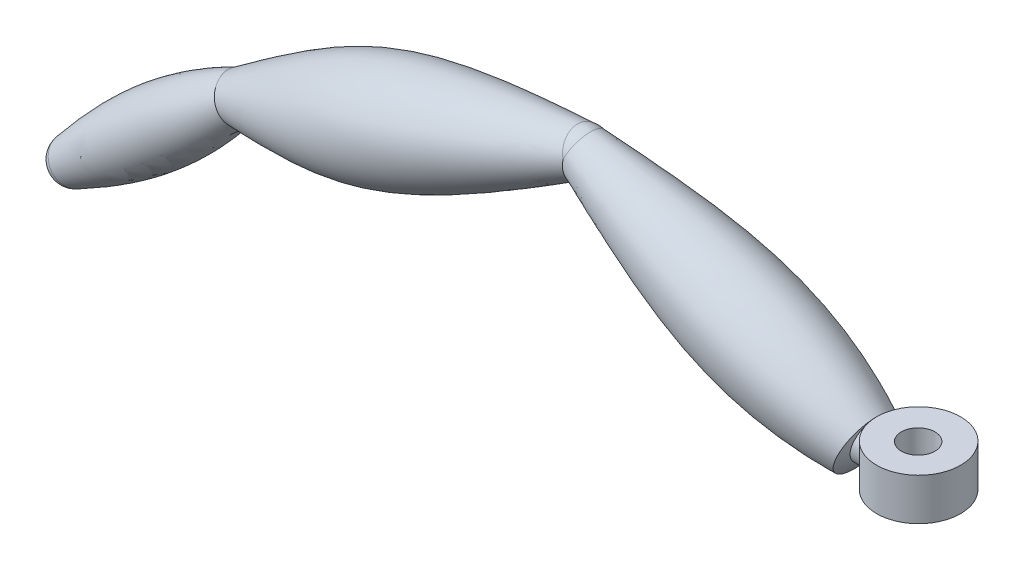
ISO-10303-21;
HEADER;
FILE_DESCRIPTION(('STEP AP214'),'2;1');
FILE_NAME('part.step','',(''),(''),'','','');
FILE_SCHEMA(('AUTOMOTIVE_DESIGN { 1 0 10303 214 1 1 1 1 }'));
ENDSEC;
DATA;
#1=APPLICATION_CONTEXT('core data for automotive mechanical design processes');
#2=APPLICATION_PROTOCOL_DEFINITION('international standard','automotive_design',2000,#1);
#3=PRODUCT_CONTEXT('',#1,'mechanical');
#4=PRODUCT('Part','Part','',(#3));
#5=PRODUCT_RELATED_PRODUCT_CATEGORY('part','',(#4));
#6=PRODUCT_DEFINITION_FORMATION('','',#4);
#7=PRODUCT_DEFINITION_CONTEXT('part definition',#1,'design');
#8=PRODUCT_DEFINITION('design','',#6,#7);
#9=PRODUCT_DEFINITION_SHAPE('','',#8);
#10=(LENGTH_UNIT() NAMED_UNIT(*) SI_UNIT(.MILLI.,.METRE.));
#11=(NAMED_UNIT(*) PLANE_ANGLE_UNIT() SI_UNIT($,.RADIAN.));
#12=(NAMED_UNIT(*) SI_UNIT($,.STERADIAN.) SOLID_ANGLE_UNIT());
#13=UNCERTAINTY_MEASURE_WITH_UNIT(LENGTH_MEASURE(1.E-05),#10,'distance_accuracy_value','');
#14=(GEOMETRIC_REPRESENTATION_CONTEXT(3) GLOBAL_UNCERTAINTY_ASSIGNED_CONTEXT((#13)) GLOBAL_UNIT_ASSIGNED_CONTEXT((#10,
#11,#12)) REPRESENTATION_CONTEXT('',''));
#15=CARTESIAN_POINT('',(0.,0.,0.));
#16=DIRECTION('',(0.,0.,1.));
#17=DIRECTION('',(1.,0.,0.));
#18=AXIS2_PLACEMENT_3D('',#15,#16,#17);
#19=CARTESIAN_POINT('',(0.,22.5,0.));
#20=DIRECTION('',(1.,0.,0.));
#21=DIRECTION('',(0.,0.,-1.));
#22=AXIS2_PLACEMENT_3D('',#19,#20,#21);
#23=CYLINDRICAL_SURFACE('',#22,2.5);
#24=CARTESIAN_POINT('',(0.,20.,0.));
#25=CARTESIAN_POINT('',(-1.17138937703847E-05,19.9999893955995,-0.0659945939242112));
#26=CARTESIAN_POINT('',(0.00130627496453097,20.0026128725809,-0.131981678166619));
#27=CARTESIAN_POINT('',(0.00651377506543621,20.0130456324057,-0.263416694327165));
#28=CARTESIAN_POINT('',(0.0104022536243341,20.0208528327151,-0.32886483207864));
#29=CARTESIAN_POINT('',(0.0206398313294794,20.0415240619075,-0.458458579220741));
#30=CARTESIAN_POINT('',(0.0269777485529216,20.0543651145348,-0.522608733342374));
#31=CARTESIAN_POINT('',(0.0419449884184015,20.0849460861392,-0.649442629369404));
#32=CARTESIAN_POINT('',(0.0505744529951445,20.1026863085656,-0.712126280180209));
#33=CARTESIAN_POINT('',(0.0795769838774978,20.162945602456,-0.897194242012672));
#34=CARTESIAN_POINT('',(0.103086993268934,20.21254753448,-1.016867788626));
#35=CARTESIAN_POINT('',(0.156324895886675,20.3288588839233,-1.2460823597176));
#36=CARTESIAN_POINT('',(0.186058997667385,20.395585398311,-1.35561310816491));
#37=CARTESIAN_POINT('',(0.251094865454986,20.5487959317913,-1.56876965448512));
#38=CARTESIAN_POINT('',(0.286623608441039,20.6362249500665,-1.6716472265544));
#39=CARTESIAN_POINT('',(0.358504634245855,20.8263147188106,-1.86195920773033));
#40=CARTESIAN_POINT('',(0.394857440796358,20.9289853999141,-1.94938346633227));
#41=CARTESIAN_POINT('',(0.467526632987598,21.1562096667926,-2.11313055563156));
#42=CARTESIAN_POINT('',(0.503621178310607,21.2818432189483,-2.18806500635172));
#43=CARTESIAN_POINT('',(0.567851214402098,21.5459216785351,-2.31542194436877));
#44=CARTESIAN_POINT('',(0.595992573888057,21.684357038768,-2.36786104603457));
#45=CARTESIAN_POINT('',(0.638553087717949,21.9616612270305,-2.44533064899433));
#46=CARTESIAN_POINT('',(0.653692868909429,22.1000079774338,-2.47181403507143));
#47=CARTESIAN_POINT('',(0.670452710474022,22.3799438729262,-2.50106742405651));
#48=CARTESIAN_POINT('',(0.672085825492837,22.5215297544934,-2.50386032467989));
#49=CARTESIAN_POINT('',(0.662226693981773,22.7857164024724,-2.48671813080397));
#50=CARTESIAN_POINT('',(0.652280691655278,22.908562742042,-2.46946102754643));
#51=CARTESIAN_POINT('',(0.62309386517335,23.1493073331544,-2.41734886311099));
#52=CARTESIAN_POINT('',(0.603850281200078,23.267204104207,-2.38248857660984));
#53=CARTESIAN_POINT('',(0.557813412874941,23.4980712134798,-2.29552507647041));
#54=CARTESIAN_POINT('',(0.530854734978881,23.6108628662725,-2.24303918598237));
#55=CARTESIAN_POINT('',(0.472415757920147,23.826582895938,-2.12260603218038));
#56=CARTESIAN_POINT('',(0.440933306029379,23.9295065378214,-2.05465139871124));
#57=CARTESIAN_POINT('',(0.372172197438131,24.1362997124444,-1.89516801589999));
#58=CARTESIAN_POINT('',(0.334664647901975,24.2386356932321,-1.80174299763042));
#59=CARTESIAN_POINT('',(0.261311546556032,24.4268334094933,-1.59889462812584));
#60=CARTESIAN_POINT('',(0.225466899968885,24.5126862501416,-1.48946269485361));
#61=CARTESIAN_POINT('',(0.157433046565047,24.6692540266303,-1.25123381518436));
#62=CARTESIAN_POINT('',(0.125494370462291,24.7390693379238,-1.12176903798507));
#63=CARTESIAN_POINT('',(0.0710285759100375,24.8552926743655,-0.851005141128091));
#64=CARTESIAN_POINT('',(0.0484845498506709,24.9017427814998,-0.709727835760625));
#65=CARTESIAN_POINT('',(0.0215341863926635,24.9567184372476,-0.472754017208435));
#66=CARTESIAN_POINT('',(0.0135128793517502,24.9728937009653,-0.379179611728296));
#67=CARTESIAN_POINT('',(0.00272311336887431,24.9945547029833,-0.190431151983904));
#68=CARTESIAN_POINT('',(-4.10790202478774E-05,25.0000317589628,-0.0952558616156545));
#69=CARTESIAN_POINT('',(0.,25.,0.));
#70=B_SPLINE_CURVE_WITH_KNOTS('',3,(#24,#25,#26,#27,#28,#29,#30,#31,#32,#33,#34,#35,#36,#37,#38,
#39,#40,#41,#42,#43,#44,#45,#46,#47,#48,#49,#50,#51,#52,#53,#54,#55,#56,#57,#58,#59,#60,#61,#62,
#63,#64,#65,#66,#67,#68,#69),.UNSPECIFIED.,.F.,.F.,(4,2,2,2,2,2,2,2,2,2,2,2,2,2,2,2,2,2,2,2,2,2,
4),(0.,0.197906017790933,0.39573257593062,0.592666505722353,0.789612636126722,1.18268518461313,
1.57615170893246,1.99321833479708,2.4105579009124,2.86029082016818,3.30969100632553,
3.7321878263024,4.1542762411573,4.52588913596464,4.89761240512583,5.27799306487008,
5.65855533951603,6.08735263258942,6.51638067188693,6.96554518397056,7.4138978039059,
7.6990904902145,7.98451453371651),.UNSPECIFIED.);
#71=CARTESIAN_POINT('',(0.,20.,0.));
#72=VERTEX_POINT('',#71);
#73=CARTESIAN_POINT('',(0.,25.,0.));
#74=VERTEX_POINT('',#73);
#75=EDGE_CURVE('E11',#72,#74,#70,.T.);
#76=ORIENTED_EDGE('',*,*,#75,.F.);
#77=CARTESIAN_POINT('',(0.,25.,0.));
#78=CARTESIAN_POINT('',(-1.17138937738109E-05,25.0000106044005,0.0659945939242115));
#79=CARTESIAN_POINT('',(0.001306274964528,24.9973871274191,0.131981678166619));
#80=CARTESIAN_POINT('',(0.00651377506543541,24.9869543675942,0.263416694327165));
#81=CARTESIAN_POINT('',(0.010402253624335,24.9791471672848,0.32886483207864));
#82=CARTESIAN_POINT('',(0.0206398313294801,24.9584759380925,0.45845857922074));
#83=CARTESIAN_POINT('',(0.0269777485529205,24.9456348854651,0.522608733342374));
#84=CARTESIAN_POINT('',(0.0419449884183994,24.9150539138607,0.649442629369405));
#85=CARTESIAN_POINT('',(0.0505744529951433,24.8973136914344,0.71212628018021));
#86=CARTESIAN_POINT('',(0.0795769838774977,24.8370543975439,0.897194242012672));
#87=CARTESIAN_POINT('',(0.103086993268933,24.78745246552,1.016867788626));
#88=CARTESIAN_POINT('',(0.156324895886674,24.6711411160767,1.2460823597176));
#89=CARTESIAN_POINT('',(0.186058997667384,24.604414601689,1.35561310816491));
#90=CARTESIAN_POINT('',(0.251094865454986,24.4512040682086,1.56876965448512));
#91=CARTESIAN_POINT('',(0.286623608441038,24.3637750499335,1.6716472265544));
#92=CARTESIAN_POINT('',(0.358504634245854,24.1736852811894,1.86195920773033));
#93=CARTESIAN_POINT('',(0.394857440796358,24.0710146000858,1.94938346633227));
#94=CARTESIAN_POINT('',(0.467526632987597,23.8437903332074,2.11313055563156));
#95=CARTESIAN_POINT('',(0.503621178310605,23.7181567810517,2.18806500635172));
#96=CARTESIAN_POINT('',(0.567851214402096,23.4540783214648,2.31542194436877));
#97=CARTESIAN_POINT('',(0.595992573888057,23.315642961232,2.36786104603457));
#98=CARTESIAN_POINT('',(0.638553087717949,23.0383387729694,2.44533064899433));
#99=CARTESIAN_POINT('',(0.653692868909428,22.8999920225661,2.47181403507143));
#100=CARTESIAN_POINT('',(0.670452710474022,22.6200561270738,2.5010674240565));
#101=CARTESIAN_POINT('',(0.672085825492838,22.4784702455066,2.50386032467989));
#102=CARTESIAN_POINT('',(0.662226693981774,22.2142835975276,2.48671813080398));
#103=CARTESIAN_POINT('',(0.652280691655279,22.091437257958,2.46946102754643));
#104=CARTESIAN_POINT('',(0.623093865173352,21.8506926668456,2.41734886311099));
#105=CARTESIAN_POINT('',(0.60385028120008,21.7327958957929,2.38248857660984));
#106=CARTESIAN_POINT('',(0.557813412874942,21.5019287865201,2.29552507647041));
#107=CARTESIAN_POINT('',(0.530854734978883,21.3891371337274,2.24303918598238));
#108=CARTESIAN_POINT('',(0.472415757920149,21.1734171040619,2.12260603218039));
#109=CARTESIAN_POINT('',(0.44093330602938,21.0704934621785,2.05465139871124));
#110=CARTESIAN_POINT('',(0.372172197438132,20.8637002875556,1.89516801589999));
#111=CARTESIAN_POINT('',(0.334664647901974,20.7613643067679,1.80174299763042));
#112=CARTESIAN_POINT('',(0.261311546556031,20.5731665905066,1.59889462812584));
#113=CARTESIAN_POINT('',(0.225466899968884,20.4873137498584,1.48946269485361));
#114=CARTESIAN_POINT('',(0.157433046565047,20.3307459733696,1.25123381518435));
#115=CARTESIAN_POINT('',(0.125494370462292,20.2609306620762,1.12176903798507));
#116=CARTESIAN_POINT('',(0.0710285759100384,20.1447073256345,0.851005141128088));
#117=CARTESIAN_POINT('',(0.0484845498506715,20.0982572185002,0.709727835760623));
#118=CARTESIAN_POINT('',(0.021534186392664,20.0432815627523,0.472754017208436));
#119=CARTESIAN_POINT('',(0.0135128793517508,20.0271062990347,0.379179611728297));
#120=CARTESIAN_POINT('',(0.00272311336887497,20.0054452970167,0.190431151983904));
#121=CARTESIAN_POINT('',(-4.10790202471508E-05,19.9999682410372,0.0952558616156554));
#122=CARTESIAN_POINT('',(0.,20.,0.));
#123=B_SPLINE_CURVE_WITH_KNOTS('',3,(#77,#78,#79,#80,#81,#82,#83,#84,#85,#86,#87,#88,#89,#90,
#91,#92,#93,#94,#95,#96,#97,#98,#99,#100,#101,#102,#103,#104,#105,#106,#107,#108,#109,#110,#111,
#112,#113,#114,#115,#116,#117,#118,#119,#120,#121,#122),.UNSPECIFIED.,.F.,.F.,(4,2,2,2,2,2,2,2,
2,2,2,2,2,2,2,2,2,2,2,2,2,2,4),(0.,0.197906017790933,0.39573257593062,0.592666505722354,
0.789612636126722,1.18268518461313,1.57615170893246,1.99321833479708,2.4105579009124,
2.86029082016819,3.30969100632553,3.7321878263024,4.1542762411573,4.52588913596463,
4.89761240512583,5.27799306487008,5.65855533951603,6.08735263258942,6.51638067188694,
6.96554518397057,7.4138978039059,7.6990904902145,7.9845145337165),.UNSPECIFIED.);
#124=EDGE_CURVE('E55',#74,#72,#123,.T.);
#125=ORIENTED_EDGE('',*,*,#124,.F.);
#126=CARTESIAN_POINT('',(-0.935635735044886,20.9236804851025,-1.94041665292619));
#127=CARTESIAN_POINT('',(-0.954114143547481,20.8165756767779,-1.85340138594638));
#128=CARTESIAN_POINT('',(-0.970277002633438,20.7163850888418,-1.75724688261863));
#129=CARTESIAN_POINT('',(-0.997715285876845,20.5329731268735,-1.54921440472621));
#130=CARTESIAN_POINT('',(-1.00898651678644,20.4497663440914,-1.43732304841541));
#131=CARTESIAN_POINT('',(-1.02695532991439,20.3031395810888,-1.20127355805157));
#132=CARTESIAN_POINT('',(-1.03366342247556,20.2396743143593,-1.07714437246948));
#133=CARTESIAN_POINT('',(-1.04354097198369,20.1342094908037,-0.819971583751555));
#134=CARTESIAN_POINT('',(-1.04671071982323,20.0922081695487,-0.686928714376323));
#135=CARTESIAN_POINT('',(-1.05089378090156,20.0308528057521,-0.415552926991139));
#136=CARTESIAN_POINT('',(-1.05190494885334,20.0115213020122,-0.277214885239686));
#137=CARTESIAN_POINT('',(-1.052736498273,19.9961273201207,0.00075924662206695));
#138=CARTESIAN_POINT('',(-1.05255680721475,20.0000662591928,0.140395415274203));
#139=CARTESIAN_POINT('',(-1.05077904647436,20.0312299653338,0.418159837924443));
#140=CARTESIAN_POINT('',(-1.04916978469227,20.0586384138259,0.556267469627318));
#141=CARTESIAN_POINT('',(-1.04326484616752,20.1361911419399,0.825881944229341));
#142=CARTESIAN_POINT('',(-1.03896935669647,20.1863338365663,0.957389246583156));
#143=CARTESIAN_POINT('',(-1.02637142488434,20.3076180714848,1.20952812023921));
#144=CARTESIAN_POINT('',(-1.01808397576384,20.3786806544722,1.33019839780461));
#145=CARTESIAN_POINT('',(-0.996728195107061,20.5396710236786,1.55773286473957));
#146=CARTESIAN_POINT('',(-0.983660123748646,20.6295977831306,1.66459780501478));
#147=CARTESIAN_POINT('',(-0.952745486374115,20.8247521458853,1.86079106480587));
#148=CARTESIAN_POINT('',(-0.934936833971689,20.9298554467285,1.95024917858314));
#149=CARTESIAN_POINT('',(-0.8948872718928,21.1527466423428,2.11038986351657));
#150=CARTESIAN_POINT('',(-0.872645977485979,21.2705356377583,2.18107080366813));
#151=CARTESIAN_POINT('',(-0.824086936025353,21.517287246711,2.3029314967221));
#152=CARTESIAN_POINT('',(-0.797713017937095,21.6463910259397,2.35380264761095));
#153=CARTESIAN_POINT('',(-0.742079227586771,21.9106443521893,2.4334568086999));
#154=CARTESIAN_POINT('',(-0.712818955729032,22.0457947349014,2.46223675566906));
#155=CARTESIAN_POINT('',(-0.651563053369597,22.3225566572777,2.4977063781364));
#156=CARTESIAN_POINT('',(-0.619512584656495,22.4642417465114,2.50372846025347));
#157=CARTESIAN_POINT('',(-0.554602091189538,22.7464224709855,2.4918316273615));
#158=CARTESIAN_POINT('',(-0.521741960168309,22.8869179468037,2.4739095530992));
#159=CARTESIAN_POINT('',(-0.455721855470192,23.1656816873625,2.41403904980484));
#160=CARTESIAN_POINT('',(-0.422568671460065,23.3038519894363,2.37162557501718));
#161=CARTESIAN_POINT('',(-0.357817242491878,23.5711557674771,2.26349534158429));
#162=CARTESIAN_POINT('',(-0.326219031115077,23.7002890483056,2.19777807992072));
#163=CARTESIAN_POINT('',(-0.265814884346227,23.9454018366489,2.04490030872383));
#164=CARTESIAN_POINT('',(-0.237001534126744,24.0614164218094,1.95779905720788));
#165=CARTESIAN_POINT('',(-0.183152038545968,24.2771161289293,1.764324047883));
#166=CARTESIAN_POINT('',(-0.158115447360038,24.3768031783796,1.65795256808123));
#167=CARTESIAN_POINT('',(-0.113326873418085,24.5544831174053,1.4315456903575));
#168=CARTESIAN_POINT('',(-0.0934653522878583,24.6329273581302,1.31188640572846));
#169=CARTESIAN_POINT('',(-0.0590590879071282,24.768494381942,1.06034601753271));
#170=CARTESIAN_POINT('',(-0.0445133456266556,24.825621171403,0.928467216307792));
#171=CARTESIAN_POINT('',(-0.0216821261972669,24.9151701508355,0.660531269987387));
#172=CARTESIAN_POINT('',(-0.0132205294648649,24.9482876047862,0.52472132556111));
#173=CARTESIAN_POINT('',(-0.00218946311505088,24.9914453704753,0.249254213532321));
#174=CARTESIAN_POINT('',(0.000380831122776001,25.0014889119278,0.109597587129353));
#175=CARTESIAN_POINT('',(-0.000463619920952294,24.9981874304712,-0.166557045054265));
#176=CARTESIAN_POINT('',(-0.0037573197069599,24.9853154340521,-0.303061358407095));
#177=CARTESIAN_POINT('',(-0.01596725870268,24.9375354975263,-0.571889329069279));
#178=CARTESIAN_POINT('',(-0.0248833338850384,24.9026282002781,-0.704213108223408));
#179=CARTESIAN_POINT('',(-0.047997027055078,24.8119385791553,-0.9609775961639));
#180=CARTESIAN_POINT('',(-0.0621939247006172,24.7561591023899,-1.08541937740329));
#181=CARTESIAN_POINT('',(-0.0953465645367183,24.6254958000976,-1.32312796826011));
#182=CARTESIAN_POINT('',(-0.114302695543325,24.5506104136632,-1.43639386378527));
#183=CARTESIAN_POINT('',(-0.156717895785037,24.3823489356358,-1.65097358206376));
#184=CARTESIAN_POINT('',(-0.180258004531685,24.2886389289581,-1.75200935240481));
#185=CARTESIAN_POINT('',(-0.230766007856311,24.0864514482049,-1.93699660425202));
#186=CARTESIAN_POINT('',(-0.257734404514362,23.9779718109198,-2.0209455786669));
#187=CARTESIAN_POINT('',(-0.315026911439443,23.745864052909,-2.1719930366585));
#188=CARTESIAN_POINT('',(-0.345426558612062,23.6218833938517,-2.23852121843486));
#189=CARTESIAN_POINT('',(-0.407848408357451,23.3648907446628,-2.34980402331011));
#190=CARTESIAN_POINT('',(-0.439870795241617,23.2318777280466,-2.39455616693047));
#191=CARTESIAN_POINT('',(-0.505241951242279,22.9570291744567,-2.4620385254596));
#192=CARTESIAN_POINT('',(-0.538603986825962,22.8150572469873,-2.48420150043086));
#193=CARTESIAN_POINT('',(-0.60469556942259,22.5292192910361,-2.50393178432671));
#194=CARTESIAN_POINT('',(-0.63742491763073,22.3853526903338,-2.50149148427703));
#195=CARTESIAN_POINT('',(-0.701241956326837,22.0988090172992,-2.47182851803117));
#196=CARTESIAN_POINT('',(-0.732317300447601,21.9561461905414,-2.44444137190179));
#197=CARTESIAN_POINT('',(-0.791356252314009,21.6772393587684,-2.36517036307035));
#198=CARTESIAN_POINT('',(-0.819323680437183,21.5409875945752,-2.31331699616645));
#199=CARTESIAN_POINT('',(-0.862250130612101,21.3236433397995,-2.20803553821192));
#200=CARTESIAN_POINT('',(-0.878397412697187,21.239557150966,-2.16114667703569));
#201=CARTESIAN_POINT('',(-0.908620185791911,21.0770773304917,-2.05780455449091));
#202=CARTESIAN_POINT('',(-0.922695720025032,20.9986835801052,-2.00135149271595));
#203=CARTESIAN_POINT('',(-0.935635735044886,20.9236804851025,-1.94041665292619));
#204=B_SPLINE_CURVE_WITH_KNOTS('',3,(#126,#127,#128,#129,#130,#131,#132,#133,#134,#135,#136,
#137,#138,#139,#140,#141,#142,#143,#144,#145,#146,#147,#148,#149,#150,#151,#152,#153,#154,#155,
#156,#157,#158,#159,#160,#161,#162,#163,#164,#165,#166,#167,#168,#169,#170,#171,#172,#173,#174,
#175,#176,#177,#178,#179,#180,#181,#182,#183,#184,#185,#186,#187,#188,#189,#190,#191,#192,#193,
#194,#195,#196,#197,#198,#199,#200,#201,#202,#203),.UNSPECIFIED.,.T.,.F.,(4,2,2,2,2,2,2,2,2,2,2,
2,2,2,2,2,2,2,2,2,2,2,2,2,2,2,2,2,2,2,2,2,2,2,2,2,2,2,4),(0.,0.417332957931416,
0.835022962717731,1.25174760856389,1.66843799233321,2.08554230801259,2.50267202656925,
2.92309651689122,3.34349170039225,3.76232010844967,4.18112572581752,4.59667758060254,
5.01226551885528,5.43409075494883,5.85597447200217,6.29014202310257,6.72436686503833,
7.1671213951041,7.60988548272405,8.05143619084411,8.49293473559161,8.92414645936969,
9.35527710091018,9.77336148678211,10.1913873487573,10.6008840369464,11.0103687790192,
11.4197976849011,11.8292600508693,12.2467548615767,12.6643108858819,13.0941877951067,
13.5241136398305,13.964587584455,14.405197757191,14.8487341620804,15.291719177822,
15.5839741861154,15.8762230961422),.UNSPECIFIED.);
#205=EDGE_CURVE('E90',#74,#74,#204,.T.);
#206=ORIENTED_EDGE('',*,*,#205,.F.);
#207=EDGE_LOOP('',(#76,#125,#206));
#208=FACE_BOUND('',#207,.T.);
#209=ADVANCED_FACE('F40',(#208),#23,.T.);
#210=CARTESIAN_POINT('',(-0.475599435394037,21.3036495228738,0.));
#211=DIRECTION('',(-0.929262266361715,0.369420682036469,0.));
#212=DIRECTION('',(-0.369420682036469,-0.929262266361715,0.));
#213=AXIS2_PLACEMENT_3D('',#210,#211,#212);
#214=CONICAL_SURFACE('',#213,1.28741962353663,1.19241080048509);
#215=CARTESIAN_POINT('',(-1.33382118596929,21.6448286236645,0.));
#216=DIRECTION('',(0.929262266361715,-0.369420682036469,0.));
#217=DIRECTION('',(0.369420682036469,0.929262266361715,0.));
#218=AXIS2_PLACEMENT_3D('',#215,#216,#217);
#219=CIRCLE('',#218,3.61057528944092);
#220=EDGE_CURVE('E159',#74,#74,#219,.T.);
#221=ORIENTED_EDGE('',*,*,#220,.T.);
#222=ORIENTED_EDGE('',*,*,#205,.T.);
#223=EDGE_LOOP('',(#221,#222));
#224=FACE_BOUND('',#223,.T.);
#225=ADVANCED_FACE('F129',(#224),#214,.T.);
#226=CARTESIAN_POINT('',(-77.1968512147098,22.2403954885555,0.));
#227=CARTESIAN_POINT('',(-63.8618564122846,31.7824757559558,0.));
#228=CARTESIAN_POINT('',(-60.0018216247643,33.9420301083723,0.));
#229=CARTESIAN_POINT('',(-34.9281959037265,37.5,0.));
#230=B_SPLINE_CURVE_WITH_KNOTS('',3,(#226,#227,#228,#229),.UNSPECIFIED.,.F.,.F.,(4,4),(0.,1.),.UNSPECIFIED.);
#231=CARTESIAN_POINT('',(-34.9281959037265,35.,0.));
#232=DIRECTION('',(0.939551436231875,0.342407795873021,0.));
#233=AXIS1_PLACEMENT('',#231,#232);
#234=SURFACE_OF_REVOLUTION('',#230,#233);
#235=CARTESIAN_POINT('',(-76.3460320930516,19.905786471581,0.));
#236=DIRECTION('',(0.939551436231875,0.342407795873021,0.));
#237=DIRECTION('',(-0.342407795873021,0.939551436231875,0.));
#238=AXIS2_PLACEMENT_3D('',#235,#236,#237);
#239=CIRCLE('',#238,2.48481235507184);
#240=CARTESIAN_POINT('',(-77.0974925021988,21.9677596953083,-1.16527512546766));
#241=VERTEX_POINT('',#240);
#242=CARTESIAN_POINT('',(-77.097492502199,21.9677596953087,1.16527512546689));
#243=VERTEX_POINT('',#242);
#244=EDGE_CURVE('E211',#241,#243,#239,.T.);
#245=ORIENTED_EDGE('',*,*,#244,.T.);
#246=CARTESIAN_POINT('',(-77.0974925021988,21.9677596953084,1.16527512546747));
#247=CARTESIAN_POINT('',(-77.08476761886,21.936426395604,1.22967200429368));
#248=CARTESIAN_POINT('',(-77.0706713245346,21.9026982179299,1.29262637304039));
#249=CARTESIAN_POINT('',(-77.0397730050384,21.8307841742657,1.41522946037097));
#250=CARTESIAN_POINT('',(-77.022971280321,21.7925988034017,1.47487854503797));
#251=CARTESIAN_POINT('',(-76.9867185491761,21.7121446040279,1.59039417917669));
#252=CARTESIAN_POINT('',(-76.9672708103272,21.669880830391,1.64626526868211));
#253=CARTESIAN_POINT('',(-76.9258401394507,21.5815797364942,1.75391009188327));
#254=CARTESIAN_POINT('',(-76.9038571977977,21.5355424019076,1.80568381002149));
#255=CARTESIAN_POINT('',(-76.8343247986095,21.3922427099335,1.95433112966774));
#256=CARTESIAN_POINT('',(-76.783164882006,21.2897329696004,2.04461633765411));
#257=CARTESIAN_POINT('',(-76.6730231869034,21.073773872857,2.20490978500427));
#258=CARTESIAN_POINT('',(-76.6140414956085,20.9603246384139,2.27491825040373));
#259=CARTESIAN_POINT('',(-76.4896032032025,20.7242782098797,2.39349055362538));
#260=CARTESIAN_POINT('',(-76.4240886633406,20.6016020671947,2.44183687003921));
#261=CARTESIAN_POINT('',(-76.2892282556393,20.3513787622661,2.51479443842021));
#262=CARTESIAN_POINT('',(-76.2198817094401,20.2238307388214,2.53940147362584));
#263=CARTESIAN_POINT('',(-76.07880200206,19.9659189832181,2.564366739295));
#264=CARTESIAN_POINT('',(-76.0070514042048,19.8355397450137,2.56446703969752));
#265=CARTESIAN_POINT('',(-75.8641023651904,19.5768606402734,2.53975338107772));
#266=CARTESIAN_POINT('',(-75.7929039104894,19.4485607226556,2.51494003504457));
#267=CARTESIAN_POINT('',(-75.653068905707,19.1972949402572,2.44094156267421));
#268=CARTESIAN_POINT('',(-75.5844387220731,19.0743422222412,2.39169969527899));
#269=CARTESIAN_POINT('',(-75.4520239992461,18.8375885584078,2.27009959931961));
#270=CARTESIAN_POINT('',(-75.3882394207897,18.7237875384348,2.19774155808808));
#271=CARTESIAN_POINT('',(-75.2679573884006,18.509484035251,2.03248391132537));
#272=CARTESIAN_POINT('',(-75.2114083815857,18.4088873219522,1.93974410429892));
#273=CARTESIAN_POINT('',(-75.1068064918639,18.2229855239793,1.73594943342333));
#274=CARTESIAN_POINT('',(-75.0587529148958,18.1376791901014,1.62489606719249));
#275=CARTESIAN_POINT('',(-74.9733010783046,17.9860796613142,1.3893282624162));
#276=CARTESIAN_POINT('',(-74.935759294355,17.9195302732049,1.26503078504447));
#277=CARTESIAN_POINT('',(-74.8716230554733,17.8058828373355,1.0052233096573));
#278=CARTESIAN_POINT('',(-74.8450276357232,17.7587830752745,0.869714301096788));
#279=CARTESIAN_POINT('',(-74.8039588955603,17.6860663033511,0.593507552174149));
#280=CARTESIAN_POINT('',(-74.7893106541932,17.6601392917904,0.452917376191692));
#281=CARTESIAN_POINT('',(-74.7719473208065,17.6294077370371,0.16872627427431));
#282=CARTESIAN_POINT('',(-74.7692314858663,17.6246018788254,0.0251255363386211));
#283=CARTESIAN_POINT('',(-74.7757898904059,17.6362088484307,-0.259662044004428));
#284=CARTESIAN_POINT('',(-74.7849584358591,17.6524346308143,-0.400859004374923));
#285=CARTESIAN_POINT('',(-74.8148110469229,17.705280185241,-0.678121384695002));
#286=CARTESIAN_POINT('',(-74.8354950106735,17.7418997768901,-0.814186850023996));
#287=CARTESIAN_POINT('',(-74.8877559607268,17.8344662057336,-1.07751031033284));
#288=CARTESIAN_POINT('',(-74.9193440214699,17.8904326921417,-1.20475919262471));
#289=CARTESIAN_POINT('',(-74.9924335658568,18.0200150987343,-1.44680868321291));
#290=CARTESIAN_POINT('',(-75.03393545954,18.0936317489357,-1.56160877633776));
#291=CARTESIAN_POINT('',(-75.1260748377439,18.2572189429873,-1.77679983035567));
#292=CARTESIAN_POINT('',(-75.1768019335804,18.3473499744243,-1.87703036480832));
#293=CARTESIAN_POINT('',(-75.2855777815263,18.5408642678264,-2.05901952121619));
#294=CARTESIAN_POINT('',(-75.3436271240767,18.644248598503,-2.14077665205374));
#295=CARTESIAN_POINT('',(-75.4662702593965,18.8630466387315,-2.28481330211874));
#296=CARTESIAN_POINT('',(-75.5309498913114,18.9786188910307,-2.34677890456926));
#297=CARTESIAN_POINT('',(-75.6641815379862,19.2172516448709,-2.4479384777033));
#298=CARTESIAN_POINT('',(-75.7327338003906,19.3403126253355,-2.48713099029458));
#299=CARTESIAN_POINT('',(-75.8726417556357,19.5923022453384,-2.5421406266382));
#300=CARTESIAN_POINT('',(-75.9440229424055,19.7212880492122,-2.55763137565418));
#301=CARTESIAN_POINT('',(-76.0865176960888,19.9800094130505,-2.56382549604965));
#302=CARTESIAN_POINT('',(-76.1576312412416,20.1097450318939,-2.55452689372778));
#303=CARTESIAN_POINT('',(-76.2978228891475,20.3672770268281,-2.51124949725469));
#304=CARTESIAN_POINT('',(-76.3668849779512,20.4950555869581,-2.47711251155572));
#305=CARTESIAN_POINT('',(-76.5002264584941,20.7443128597699,-2.38488318658848));
#306=CARTESIAN_POINT('',(-76.5645059360809,20.86579168552,-2.32679127743259));
#307=CARTESIAN_POINT('',(-76.685873542223,21.0987167095986,-2.18845170771256));
#308=CARTESIAN_POINT('',(-76.7429845760068,21.2101945205081,-2.10827737344487));
#309=CARTESIAN_POINT('',(-76.8482282502644,21.4204254244974,-1.927900140214));
#310=CARTESIAN_POINT('',(-76.8963645688746,21.5191837253015,-1.82770548127885));
#311=CARTESIAN_POINT('',(-76.9720159912098,21.6797283470821,-1.6356796359812));
#312=CARTESIAN_POINT('',(-77.0017198791216,21.7447545116835,-1.54739422342088));
#313=CARTESIAN_POINT('',(-77.0413354244379,21.834462999794,-1.40860524176898));
#314=CARTESIAN_POINT('',(-77.0537161167113,21.8630579426209,-1.36128775103866));
#315=CARTESIAN_POINT('',(-77.0768361464072,21.9175043519157,-1.26469949773748));
#316=CARTESIAN_POINT('',(-77.0875751363423,21.9433552372157,-1.21542832441625));
#317=CARTESIAN_POINT('',(-77.0974925021989,21.9677596953087,-1.16527512546696));
#318=B_SPLINE_CURVE_WITH_KNOTS('',3,(#246,#247,#248,#249,#250,#251,#252,#253,#254,#255,#256,
#257,#258,#259,#260,#261,#262,#263,#264,#265,#266,#267,#268,#269,#270,#271,#272,#273,#274,#275,
#276,#277,#278,#279,#280,#281,#282,#283,#284,#285,#286,#287,#288,#289,#290,#291,#292,#293,#294,
#295,#296,#297,#298,#299,#300,#301,#302,#303,#304,#305,#306,#307,#308,#309,#310,#311,#312,#313,
#314,#315,#316,#317),.UNSPECIFIED.,.F.,.F.,(4,2,2,2,2,2,2,2,2,2,2,2,2,2,2,2,2,2,2,2,2,2,2,2,2,2,
2,2,2,2,2,2,2,2,2,4),(0.,0.218135630726401,0.436247052929329,0.654091532216101,
0.871936838608405,1.30730858193364,1.74267547175075,2.18232117635887,2.62204495999238,
3.06639657956426,3.51073726633018,3.95611490677387,4.40148893798493,4.84348835102617,
5.28545163682157,5.72104816542571,6.1566062921091,6.58566667807731,7.01470035004113,
7.43994445402565,7.8651847965619,8.29085829941993,8.71654941131775,9.14662090925503,
9.57672710888127,10.0133507076462,10.4500022590235,10.8926140724928,11.3352611272889,
11.7807522825413,12.2262354393159,12.6702568093214,13.1140958026665,13.4538858250149,
13.6237428506708,13.7936357791236),.UNSPECIFIED.);
#319=EDGE_CURVE('E69',#243,#241,#318,.T.);
#320=ORIENTED_EDGE('',*,*,#319,.T.);
#321=EDGE_LOOP('',(#245,#320));
#322=FACE_BOUND('',#321,.T.);
#323=CARTESIAN_POINT('',(-34.8740778431341,35.3356566848046,2.47677326888508));
#324=CARTESIAN_POINT('',(-34.8762525849167,35.2957471185694,2.48450618262137));
#325=CARTESIAN_POINT('',(-34.8782697156321,35.2556709400328,2.49139536525344));
#326=CARTESIAN_POINT('',(-34.882053754264,35.1752538930971,2.50348001095858));
#327=CARTESIAN_POINT('',(-34.8838206725403,35.134913035729,2.50867554416615));
#328=CARTESIAN_POINT('',(-34.8888429044505,35.0136140014151,2.52171069637926));
#329=CARTESIAN_POINT('',(-34.8918208450604,34.9323568408931,2.52700322360326));
#330=CARTESIAN_POINT('',(-34.8973140801705,34.7696370284406,2.53076287200824));
#331=CARTESIAN_POINT('',(-34.8998291619848,34.6881742993921,2.52922686355713));
#332=CARTESIAN_POINT('',(-34.9045400457779,34.5256736107265,2.51933775397105));
#333=CARTESIAN_POINT('',(-34.9067358455333,34.4446356540712,2.51098460536445));
#334=CARTESIAN_POINT('',(-34.912981613634,34.20296060038,2.47571202418561));
#335=CARTESIAN_POINT('',(-34.916692668337,34.0436740002291,2.43858145970051));
#336=CARTESIAN_POINT('',(-34.9235266007795,33.733857728766,2.33772530884654));
#337=CARTESIAN_POINT('',(-34.9266496943612,33.5833248580175,2.27400950972167));
#338=CARTESIAN_POINT('',(-34.9323693522074,33.297897497065,2.1223428857156));
#339=CARTESIAN_POINT('',(-34.9349732843933,33.1627978750816,2.03478039367658));
#340=CARTESIAN_POINT('',(-34.939733930368,32.9103813553572,1.83688660336655));
#341=CARTESIAN_POINT('',(-34.9418907291626,32.7930610786748,1.72655964088932));
#342=CARTESIAN_POINT('',(-34.9456247091249,32.5871348566605,1.49307974281246));
#343=CARTESIAN_POINT('',(-34.9472284538678,32.4972489258135,1.37105760989876));
#344=CARTESIAN_POINT('',(-34.94999259101,32.341073087475,1.1127435904585));
#345=CARTESIAN_POINT('',(-34.9511532222809,32.2747704681219,0.976459442863715));
#346=CARTESIAN_POINT('',(-34.9529368195741,32.1724427407306,0.703829242810724));
#347=CARTESIAN_POINT('',(-34.9535917515098,32.1346221697816,0.568156155133764));
#348=CARTESIAN_POINT('',(-34.9544751222956,32.0835419347446,0.292268011503276));
#349=CARTESIAN_POINT('',(-34.9547036970023,32.0702744469482,0.152054416853236));
#350=CARTESIAN_POINT('',(-34.954727409442,32.0688987740152,-0.121923805980147));
#351=CARTESIAN_POINT('',(-34.9545422689096,32.0796458193573,-0.255684153267232));
#352=CARTESIAN_POINT('',(-34.9537837402591,32.1235300565409,-0.519462583694275));
#353=CARTESIAN_POINT('',(-34.9532103791311,32.1566656918758,-0.649480926331963));
#354=CARTESIAN_POINT('',(-34.9516920386968,32.2439079793768,-0.901815236762734));
#355=CARTESIAN_POINT('',(-34.9507481670731,32.2979521163611,-1.02415291375065));
#356=CARTESIAN_POINT('',(-34.9485088786464,32.4250650190058,-1.25848497962287));
#357=CARTESIAN_POINT('',(-34.9472134110423,32.4981365338215,-1.37047787067883));
#358=CARTESIAN_POINT('',(-34.9442349669735,32.6640872787283,-1.58573287013216));
#359=CARTESIAN_POINT('',(-34.9425388458295,32.7576279782578,-1.68848400023131));
#360=CARTESIAN_POINT('',(-34.9388079419163,32.959693150335,-1.87797085427804));
#361=CARTESIAN_POINT('',(-34.9367730824435,33.068221015617,-1.96470294147812));
#362=CARTESIAN_POINT('',(-34.932227385742,33.3045151666443,-2.12557651917762));
#363=CARTESIAN_POINT('',(-34.9296944810709,33.4330666793865,-2.19856356706566));
#364=CARTESIAN_POINT('',(-34.9242168760789,33.7000705086173,-2.32343165226021));
#365=CARTESIAN_POINT('',(-34.9212719488499,33.8385282599729,-2.37530099771874));
#366=CARTESIAN_POINT('',(-34.9146571508184,34.1308932626288,-2.45977558006463));
#367=CARTESIAN_POINT('',(-34.9109527602014,34.2852208996292,-2.49092154527999));
#368=CARTESIAN_POINT('',(-34.902642633954,34.5967701017696,-2.52787883269409));
#369=CARTESIAN_POINT('',(-34.8980377419378,34.7539888345145,-2.5337137492705));
#370=CARTESIAN_POINT('',(-34.8899922415339,34.9819347934255,-2.52378910131876));
#371=CARTESIAN_POINT('',(-34.8872785155639,35.0532416761475,-2.51804024924108));
#372=CARTESIAN_POINT('',(-34.8812170731971,35.1950810725487,-2.50131197805815));
#373=CARTESIAN_POINT('',(-34.8778705072393,35.2656147494307,-2.490341996382));
#374=CARTESIAN_POINT('',(-34.874077843134,35.3356566848044,-2.47677326888511));
#375=B_SPLINE_CURVE_WITH_KNOTS('',3,(#323,#324,#325,#326,#327,#328,#329,#330,#331,#332,#333,
#334,#335,#336,#337,#338,#339,#340,#341,#342,#343,#344,#345,#346,#347,#348,#349,#350,#351,#352,
#353,#354,#355,#356,#357,#358,#359,#360,#361,#362,#363,#364,#365,#366,#367,#368,#369,#370,#371,
#372,#373,#374),.UNSPECIFIED.,.F.,.F.,(4,2,2,2,2,2,2,2,2,2,2,2,2,2,2,2,2,2,2,2,2,2,2,2,2,4),(0.,
0.122110195669185,0.244215334077528,0.488356933136259,0.732610437905233,0.976865643565019,
1.46511422097167,1.95318321006005,2.43373588815408,2.91419712299658,3.36649694481407,
3.81855259749085,4.23894454381455,4.65920251141345,5.05985612896989,5.46048189502407,
5.85991895751057,6.25941376439085,6.67449199266294,7.08966433917787,7.53129176329039,
7.97316336367901,8.44355180701162,8.91350167069482,9.12810461402709,9.34232111749539),.UNSPECIFIED.);
#376=CARTESIAN_POINT('',(-34.874077843134,35.3356566848044,2.47677326888511));
#377=VERTEX_POINT('',#376);
#378=CARTESIAN_POINT('',(-34.874077843134,35.3356566848044,-2.47677326888511));
#379=VERTEX_POINT('',#378);
#380=EDGE_CURVE('E163',#377,#379,#375,.T.);
#381=ORIENTED_EDGE('',*,*,#380,.F.);
#382=CARTESIAN_POINT('',(-34.7724387886663,35.0567637368244,0.));
#383=DIRECTION('',(0.939551436231875,0.342407795873021,0.));
#384=DIRECTION('',(-0.342407795873021,0.939551436231875,0.));
#385=AXIS2_PLACEMENT_3D('',#382,#383,#384);
#386=CIRCLE('',#385,2.4944974642781);
#387=EDGE_CURVE('E170',#379,#377,#386,.T.);
#388=ORIENTED_EDGE('',*,*,#387,.F.);
#389=EDGE_LOOP('',(#381,#388));
#390=FACE_BOUND('',#389,.T.);
#391=ADVANCED_FACE('F133',(#322,#390),#234,.T.);
#392=CARTESIAN_POINT('',(-34.9281959037265,35.,0.));
#393=DIRECTION('',(0.929262266361715,-0.369420682036469,0.));
#394=DIRECTION('',(-0.369420682036469,-0.929262266361715,0.));
#395=AXIS2_PLACEMENT_3D('',#392,#393,#394);
#396=SPHERICAL_SURFACE('',#395,2.5);
#397=CARTESIAN_POINT('',(-34.9966905706839,35.0272294996786,0.));
#398=DIRECTION('',(0.929262266361715,-0.369420682036469,0.));
#399=DIRECTION('',(0.369420682036469,0.929262266361715,0.));
#400=AXIS2_PLACEMENT_3D('',#397,#398,#399);
#401=CIRCLE('',#400,2.49891317074957);
#402=EDGE_CURVE('E61',#379,#377,#401,.T.);
#403=ORIENTED_EDGE('',*,*,#402,.F.);
#404=ORIENTED_EDGE('',*,*,#387,.T.);
#405=EDGE_LOOP('',(#403,#404));
#406=FACE_BOUND('',#405,.T.);
#407=ADVANCED_FACE('F138',(#406),#396,.T.);
#408=CARTESIAN_POINT('',(-97.3361890251334,5.43194589598582,0.));
#409=CARTESIAN_POINT('',(-91.8688040719916,12.1034221494587,0.));
#410=CARTESIAN_POINT('',(-86.5928066162683,17.3570631834916,0.));
#411=CARTESIAN_POINT('',(-77.1968512147098,22.2403954885555,0.));
#412=B_SPLINE_CURVE_WITH_KNOTS('',3,(#408,#409,#410,#411),.UNSPECIFIED.,.F.,.F.,(4,4),(0.,1.),.UNSPECIFIED.);
#413=CARTESIAN_POINT('',(-34.9281959037265,35.,0.));
#414=DIRECTION('',(0.939551436231875,0.342407795873021,0.));
#415=AXIS1_PLACEMENT('',#413,#414);
#416=SURFACE_OF_REVOLUTION('',#412,#415);
#417=EDGE_CURVE('E200',#243,#241,#239,.T.);
#418=ORIENTED_EDGE('',*,*,#417,.F.);
#419=ORIENTED_EDGE('',*,*,#244,.F.);
#420=EDGE_LOOP('',(#418,#419));
#421=FACE_BOUND('',#420,.T.);
#422=CARTESIAN_POINT('',(-76.4401746904137,19.8714773768179,0.));
#423=DIRECTION('',(0.939551436231875,0.342407795873021,0.));
#424=DIRECTION('',(-0.342407795873021,0.939551436231875,0.));
#425=AXIS2_PLACEMENT_3D('',#422,#423,#424);
#426=CIRCLE('',#425,2.47166192894835);
#427=CARTESIAN_POINT('',(-77.2864910036306,22.1937308920501,0.));
#428=VERTEX_POINT('',#427);
#429=EDGE_CURVE('E215',#428,#428,#426,.T.);
#430=ORIENTED_EDGE('',*,*,#429,.T.);
#431=EDGE_LOOP('',(#430));
#432=FACE_BOUND('',#431,.T.);
#433=ADVANCED_FACE('F178',(#421,#432),#416,.T.);
#434=CARTESIAN_POINT('',(-76.0875144512064,20.,0.));
#435=DIRECTION('',(0.767069503666943,0.641564008142718,0.));
#436=DIRECTION('',(-0.641564008142718,0.767069503666943,0.));
#437=AXIS2_PLACEMENT_3D('',#434,#435,#436);
#438=SPHERICAL_SURFACE('',#437,2.50000000000001);
#439=CARTESIAN_POINT('',(-75.7133989792836,20.312903877064,0.));
#440=DIRECTION('',(0.767069503666943,0.641564008142718,0.));
#441=DIRECTION('',(-0.641564008142718,0.767069503666943,0.));
#442=AXIS2_PLACEMENT_3D('',#439,#440,#441);
#443=CIRCLE('',#442,2.45196426919038);
#444=EDGE_CURVE('E207',#241,#428,#443,.T.);
#445=ORIENTED_EDGE('',*,*,#444,.T.);
#446=ORIENTED_EDGE('',*,*,#429,.F.);
#447=EDGE_CURVE('E189',#428,#243,#443,.T.);
#448=ORIENTED_EDGE('',*,*,#447,.T.);
#449=ORIENTED_EDGE('',*,*,#417,.T.);
#450=EDGE_LOOP('',(#445,#446,#448,#449));
#451=FACE_BOUND('',#450,.T.);
#452=ADVANCED_FACE('F42',(#451),#438,.F.);
#453=CARTESIAN_POINT('',(-97.3361890251334,5.43194589598582,0.));
#454=CARTESIAN_POINT('',(-91.8688040719916,12.1034221494587,0.));
#455=CARTESIAN_POINT('',(-86.5928066162683,17.3570631834916,0.));
#456=CARTESIAN_POINT('',(-77.1968512147098,22.2403954885555,0.));
#457=B_SPLINE_CURVE_WITH_KNOTS('',3,(#453,#454,#455,#456),.UNSPECIFIED.,.F.,.F.,(4,4),(0.,1.),.UNSPECIFIED.);
#458=CARTESIAN_POINT('',(-76.0875144512064,20.,0.));
#459=DIRECTION('',(0.767069503666943,0.641564008142718,0.));
#460=AXIS1_PLACEMENT('',#458,#459);
#461=SURFACE_OF_REVOLUTION('',#457,#460);
#462=CARTESIAN_POINT('',(-95.7594333320375,3.54673850972919,0.));
#463=DIRECTION('',(0.767069503666943,0.641564008142718,0.));
#464=DIRECTION('',(-0.641564008142718,0.767069503666943,0.));
#465=AXIS2_PLACEMENT_3D('',#462,#463,#464);
#466=CIRCLE('',#465,2.45767479640955);
#467=CARTESIAN_POINT('',(-97.3361890251334,5.43194589598582,0.));
#468=VERTEX_POINT('',#467);
#469=EDGE_CURVE('E202',#468,#468,#466,.T.);
#470=ORIENTED_EDGE('',*,*,#469,.T.);
#471=EDGE_LOOP('',(#470));
#472=FACE_BOUND('',#471,.T.);
#473=ORIENTED_EDGE('',*,*,#319,.F.);
#474=ORIENTED_EDGE('',*,*,#447,.F.);
#475=ORIENTED_EDGE('',*,*,#444,.F.);
#476=EDGE_LOOP('',(#473,#474,#475));
#477=FACE_BOUND('',#476,.T.);
#478=ADVANCED_FACE('F191',(#472,#477),#461,.T.);
#479=CARTESIAN_POINT('',(-95.4080563871444,3.84062426591809,0.));
#480=DIRECTION('',(0.767069503666943,0.641564008142718,0.));
#481=DIRECTION('',(-0.641564008142718,0.767069503666943,0.));
#482=AXIS2_PLACEMENT_3D('',#479,#480,#481);
#483=SPHERICAL_SURFACE('',#482,2.49999999999999);
#484=ORIENTED_EDGE('',*,*,#469,.F.);
#485=EDGE_LOOP('',(#484));
#486=FACE_BOUND('',#485,.T.);
#487=ADVANCED_FACE('F148',(#486),#483,.T.);
#488=CARTESIAN_POINT('',(-34.9281959037265,37.5,0.));
#489=CARTESIAN_POINT('',(-21.5155879771363,35.1336588945921,0.));
#490=CARTESIAN_POINT('',(-10.8877323362877,33.4238160859367,0.));
#491=CARTESIAN_POINT('',(0.,25.,0.));
#492=B_SPLINE_CURVE_WITH_KNOTS('',3,(#488,#489,#490,#491),.UNSPECIFIED.,.F.,.F.,(4,4),(0.,1.),.UNSPECIFIED.);
#493=CARTESIAN_POINT('',(0.,21.1145788222122,0.));
#494=DIRECTION('',(0.929262266361715,-0.369420682036469,0.));
#495=AXIS1_PLACEMENT('',#493,#494);
#496=SURFACE_OF_REVOLUTION('',#492,#495);
#497=ORIENTED_EDGE('',*,*,#220,.F.);
#498=EDGE_LOOP('',(#497));
#499=FACE_BOUND('',#498,.T.);
#500=ORIENTED_EDGE('',*,*,#402,.T.);
#501=ORIENTED_EDGE('',*,*,#380,.T.);
#502=EDGE_LOOP('',(#500,#501));
#503=FACE_BOUND('',#502,.T.);
#504=ADVANCED_FACE('F115',(#499,#503),#496,.T.);
#505=CARTESIAN_POINT('',(5.,25.,0.));
#506=DIRECTION('',(0.,1.,0.));
#507=DIRECTION('',(-1.,0.,0.));
#508=AXIS2_PLACEMENT_3D('',#505,#506,#507);
#509=CYLINDRICAL_SURFACE('',#508,5.);
#510=CARTESIAN_POINT('',(5.,20.,0.));
#511=DIRECTION('',(0.,1.,0.));
#512=DIRECTION('',(-1.,0.,0.));
#513=AXIS2_PLACEMENT_3D('',#510,#511,#512);
#514=CIRCLE('',#513,5.);
#515=EDGE_CURVE('E97',#72,#72,#514,.T.);
#516=ORIENTED_EDGE('',*,*,#515,.T.);
#517=ORIENTED_EDGE('',*,*,#75,.T.);
#518=CARTESIAN_POINT('',(5.,25.,0.));
#519=DIRECTION('',(0.,1.,0.));
#520=DIRECTION('',(-1.,0.,0.));
#521=AXIS2_PLACEMENT_3D('',#518,#519,#520);
#522=CIRCLE('',#521,5.);
#523=EDGE_CURVE('E98',#74,#74,#522,.T.);
#524=ORIENTED_EDGE('',*,*,#523,.F.);
#525=ORIENTED_EDGE('',*,*,#124,.T.);
#526=EDGE_LOOP('',(#516,#517,#524,#525));
#527=FACE_BOUND('',#526,.T.);
#528=ADVANCED_FACE('F95',(#527),#509,.T.);
#529=CARTESIAN_POINT('',(0.,25.,0.));
#530=DIRECTION('',(0.,-1.,0.));
#531=DIRECTION('',(1.,0.,0.));
#532=AXIS2_PLACEMENT_3D('',#529,#530,#531);
#533=PLANE('',#532);
#534=CARTESIAN_POINT('',(5.02367108113778,25.,0.0816925104935719));
#535=DIRECTION('',(0.,1.,0.));
#536=DIRECTION('',(-1.,0.,0.));
#537=AXIS2_PLACEMENT_3D('',#534,#535,#536);
#538=CIRCLE('',#537,2.);
#539=CARTESIAN_POINT('',(3.02367108113778,25.,0.0816925104935719));
#540=VERTEX_POINT('',#539);
#541=EDGE_CURVE('E351',#540,#540,#538,.T.);
#542=ORIENTED_EDGE('',*,*,#541,.F.);
#543=EDGE_LOOP('',(#542));
#544=FACE_BOUND('',#543,.T.);
#545=ORIENTED_EDGE('',*,*,#523,.T.);
#546=EDGE_LOOP('',(#545));
#547=FACE_BOUND('',#546,.T.);
#548=ADVANCED_FACE('F114',(#544,#547),#533,.F.);
#549=CARTESIAN_POINT('',(0.,20.,0.));
#550=DIRECTION('',(0.,-1.,0.));
#551=DIRECTION('',(1.,0.,0.));
#552=AXIS2_PLACEMENT_3D('',#549,#550,#551);
#553=PLANE('',#552);
#554=CARTESIAN_POINT('',(5.02367108113778,20.,0.0816925104935719));
#555=DIRECTION('',(0.,-1.,0.));
#556=DIRECTION('',(1.,0.,0.));
#557=AXIS2_PLACEMENT_3D('',#554,#555,#556);
#558=CIRCLE('',#557,2.);
#559=CARTESIAN_POINT('',(7.02367108113778,20.,0.0816925104935719));
#560=VERTEX_POINT('',#559);
#561=EDGE_CURVE('E157',#560,#560,#558,.T.);
#562=ORIENTED_EDGE('',*,*,#561,.F.);
#563=EDGE_LOOP('',(#562));
#564=FACE_BOUND('',#563,.T.);
#565=ORIENTED_EDGE('',*,*,#515,.F.);
#566=EDGE_LOOP('',(#565));
#567=FACE_BOUND('',#566,.T.);
#568=ADVANCED_FACE('F116',(#564,#567),#553,.T.);
#569=CARTESIAN_POINT('',(5.02367108113778,15.,0.0816925104935719));
#570=DIRECTION('',(0.,1.,0.));
#571=DIRECTION('',(-1.,0.,0.));
#572=AXIS2_PLACEMENT_3D('',#569,#570,#571);
#573=CYLINDRICAL_SURFACE('',#572,2.);
#574=ORIENTED_EDGE('',*,*,#561,.T.);
#575=EDGE_LOOP('',(#574));
#576=FACE_BOUND('',#575,.T.);
#577=ORIENTED_EDGE('',*,*,#541,.T.);
#578=EDGE_LOOP('',(#577));
#579=FACE_BOUND('',#578,.T.);
#580=ADVANCED_FACE('F124',(#576,#579),#573,.F.);
#581=CLOSED_SHELL('',(#209,#225,#391,#407,#433,#452,#478,#487,#504,#528,#548,#568,#580));
#582=CARTESIAN_POINT('',(-34.9281959037266,35.,0.));
#583=DIRECTION('',(-0.929262266361715,0.369420682036469,0.));
#584=DIRECTION('',(-0.369420682036469,-0.929262266361715,0.));
#585=AXIS2_PLACEMENT_3D('',#582,#583,#584);
#586=CONICAL_SURFACE('',#585,0.,0.727863938919952);
#587=CARTESIAN_POINT('',(-36.6626573621613,35.6895210944587,0.));
#588=DIRECTION('',(0.929262266361715,-0.369420682036469,0.));
#589=DIRECTION('',(0.369420682036469,0.929262266361715,0.));
#590=AXIS2_PLACEMENT_3D('',#587,#588,#589);
#591=CIRCLE('',#590,1.66319094198501);
#592=CARTESIAN_POINT('',(-36.0482402300163,37.2350616786,0.));
#593=VERTEX_POINT('',#592);
#594=EDGE_CURVE('E188',#593,#593,#591,.F.);
#595=ORIENTED_EDGE('',*,*,#594,.T.);
#596=EDGE_LOOP('',(#595));
#597=FACE_BOUND('',#596,.T.);
#598=CARTESIAN_POINT('',(-34.9281959037265,35.,0.));
#599=VERTEX_POINT('',#598);
#600=VERTEX_LOOP('',#599);
#601=FACE_BOUND('',#600,.T.);
#602=ADVANCED_FACE('F233',(#597,#601),#586,.F.);
#603=CARTESIAN_POINT('',(-34.9281959037265,35.,0.));
#604=DIRECTION('',(0.939551436231875,0.342407795873021,0.));
#605=DIRECTION('',(-0.342407795873021,0.939551436231875,0.));
#606=AXIS2_PLACEMENT_3D('',#603,#604,#605);
#607=SPHERICAL_SURFACE('',#606,2.5);
#608=CARTESIAN_POINT('',(-34.9281959037265,35.,0.));
#609=DIRECTION('',(0.929262266361715,-0.369420682036469,0.));
#610=DIRECTION('',(0.369420682036469,0.929262266361715,0.));
#611=AXIS2_PLACEMENT_3D('',#608,#609,#610);
#612=SPHERICAL_SURFACE('',#611,2.5);
#613=ORIENTED_EDGE('',*,*,#594,.F.);
#614=EDGE_LOOP('',(#613));
#615=FACE_BOUND('',#614,.T.);
#616=ADVANCED_FACE('F236',(#615),#612,.F.);
#617=CLOSED_SHELL('',(#602,#616));
#618=ORIENTED_CLOSED_SHELL('',*,#617,.T.);
#619=BREP_WITH_VOIDS('B2',#581,(#618));
#620=ADVANCED_BREP_SHAPE_REPRESENTATION('',(#18,#619),#14);
#621=SHAPE_DEFINITION_REPRESENTATION(#9,#620);
ENDSEC;
END-ISO-10303-21;
